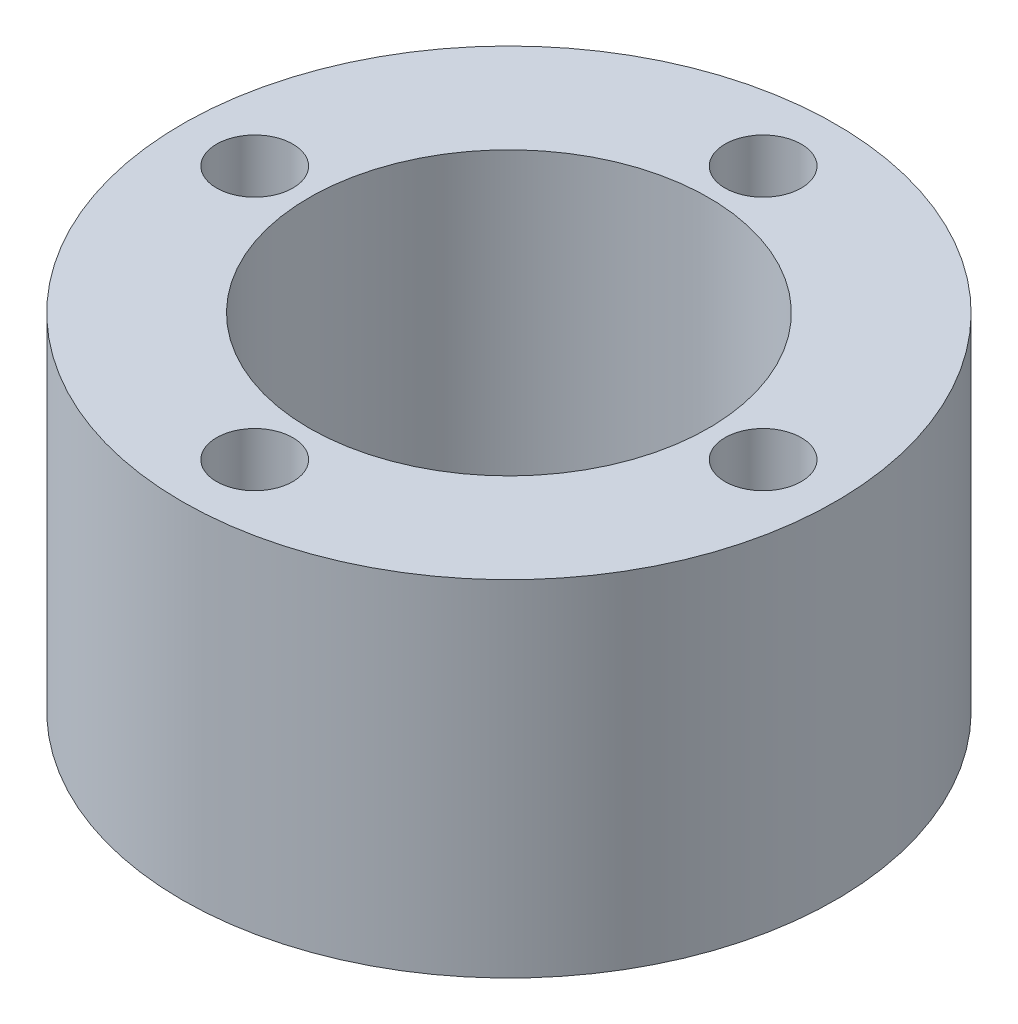
ISO-10303-21;
HEADER;
FILE_DESCRIPTION(('STEP AP214'),'2;1');
FILE_NAME('part.step','',(''),(''),'','','');
FILE_SCHEMA(('AUTOMOTIVE_DESIGN { 1 0 10303 214 1 1 1 1 }'));
ENDSEC;
DATA;
#1=APPLICATION_CONTEXT('core data for automotive mechanical design processes');
#2=APPLICATION_PROTOCOL_DEFINITION('international standard','automotive_design',2000,#1);
#3=PRODUCT_CONTEXT('',#1,'mechanical');
#4=PRODUCT('Part','Part','',(#3));
#5=PRODUCT_RELATED_PRODUCT_CATEGORY('part','',(#4));
#6=PRODUCT_DEFINITION_FORMATION('','',#4);
#7=PRODUCT_DEFINITION_CONTEXT('part definition',#1,'design');
#8=PRODUCT_DEFINITION('design','',#6,#7);
#9=PRODUCT_DEFINITION_SHAPE('','',#8);
#10=(LENGTH_UNIT() NAMED_UNIT(*) SI_UNIT(.MILLI.,.METRE.));
#11=(NAMED_UNIT(*) PLANE_ANGLE_UNIT() SI_UNIT($,.RADIAN.));
#12=(NAMED_UNIT(*) SI_UNIT($,.STERADIAN.) SOLID_ANGLE_UNIT());
#13=UNCERTAINTY_MEASURE_WITH_UNIT(LENGTH_MEASURE(1.E-05),#10,'distance_accuracy_value','');
#14=(GEOMETRIC_REPRESENTATION_CONTEXT(3) GLOBAL_UNCERTAINTY_ASSIGNED_CONTEXT((#13)) GLOBAL_UNIT_ASSIGNED_CONTEXT((#10,
#11,#12)) REPRESENTATION_CONTEXT('',''));
#15=CARTESIAN_POINT('',(0.,0.,0.));
#16=DIRECTION('',(0.,0.,1.));
#17=DIRECTION('',(1.,0.,0.));
#18=AXIS2_PLACEMENT_3D('',#15,#16,#17);
#19=CARTESIAN_POINT('',(0.,9.5,0.));
#20=DIRECTION('',(0.,1.,0.));
#21=DIRECTION('',(0.,0.,1.));
#22=AXIS2_PLACEMENT_3D('',#19,#20,#21);
#23=PLANE('',#22);
#24=CARTESIAN_POINT('',(-7.,9.5,0.));
#25=DIRECTION('',(0.,1.,0.));
#26=DIRECTION('',(0.,0.,1.));
#27=AXIS2_PLACEMENT_3D('',#24,#25,#26);
#28=CIRCLE('',#27,1.05);
#29=CARTESIAN_POINT('',(-7.,9.5,1.05));
#30=VERTEX_POINT('',#29);
#31=EDGE_CURVE('E67',#30,#30,#28,.T.);
#32=ORIENTED_EDGE('',*,*,#31,.F.);
#33=EDGE_LOOP('',(#32));
#34=FACE_BOUND('',#33,.T.);
#35=CARTESIAN_POINT('',(7.,9.5,0.));
#36=DIRECTION('',(0.,1.,0.));
#37=DIRECTION('',(0.,0.,1.));
#38=AXIS2_PLACEMENT_3D('',#35,#36,#37);
#39=CIRCLE('',#38,1.05);
#40=CARTESIAN_POINT('',(7.,9.5,1.05));
#41=VERTEX_POINT('',#40);
#42=EDGE_CURVE('E55',#41,#41,#39,.T.);
#43=ORIENTED_EDGE('',*,*,#42,.F.);
#44=EDGE_LOOP('',(#43));
#45=FACE_BOUND('',#44,.T.);
#46=CARTESIAN_POINT('',(0.,9.5,0.));
#47=DIRECTION('',(0.,1.,0.));
#48=DIRECTION('',(0.,0.,1.));
#49=AXIS2_PLACEMENT_3D('',#46,#47,#48);
#50=CIRCLE('',#49,9.);
#51=CARTESIAN_POINT('',(0.,9.5,9.));
#52=VERTEX_POINT('',#51);
#53=EDGE_CURVE('E10',#52,#52,#50,.T.);
#54=ORIENTED_EDGE('',*,*,#53,.T.);
#55=EDGE_LOOP('',(#54));
#56=FACE_BOUND('',#55,.T.);
#57=CARTESIAN_POINT('',(0.,9.5,-7.));
#58=DIRECTION('',(0.,1.,0.));
#59=DIRECTION('',(0.,0.,1.));
#60=AXIS2_PLACEMENT_3D('',#57,#58,#59);
#61=CIRCLE('',#60,1.05);
#62=CARTESIAN_POINT('',(0.,9.5,-5.95));
#63=VERTEX_POINT('',#62);
#64=EDGE_CURVE('E50',#63,#63,#61,.T.);
#65=ORIENTED_EDGE('',*,*,#64,.F.);
#66=EDGE_LOOP('',(#65));
#67=FACE_BOUND('',#66,.T.);
#68=CARTESIAN_POINT('',(0.,9.5,7.));
#69=DIRECTION('',(0.,1.,0.));
#70=DIRECTION('',(0.,0.,1.));
#71=AXIS2_PLACEMENT_3D('',#68,#69,#70);
#72=CIRCLE('',#71,1.05);
#73=CARTESIAN_POINT('',(0.,9.5,8.05));
#74=VERTEX_POINT('',#73);
#75=EDGE_CURVE('E61',#74,#74,#72,.T.);
#76=ORIENTED_EDGE('',*,*,#75,.F.);
#77=EDGE_LOOP('',(#76));
#78=FACE_BOUND('',#77,.T.);
#79=CARTESIAN_POINT('',(0.,9.5,0.));
#80=DIRECTION('',(0.,1.,0.));
#81=DIRECTION('',(0.,0.,1.));
#82=AXIS2_PLACEMENT_3D('',#79,#80,#81);
#83=CIRCLE('',#82,5.5);
#84=CARTESIAN_POINT('',(0.,9.5,5.5));
#85=VERTEX_POINT('',#84);
#86=EDGE_CURVE('E73',#85,#85,#83,.T.);
#87=ORIENTED_EDGE('',*,*,#86,.F.);
#88=EDGE_LOOP('',(#87));
#89=FACE_BOUND('',#88,.T.);
#90=ADVANCED_FACE('F39',(#34,#45,#56,#67,#78,#89),#23,.T.);
#91=CARTESIAN_POINT('',(0.,0.,0.));
#92=DIRECTION('',(0.,1.,0.));
#93=DIRECTION('',(0.,0.,1.));
#94=AXIS2_PLACEMENT_3D('',#91,#92,#93);
#95=PLANE('',#94);
#96=CARTESIAN_POINT('',(0.,0.,0.));
#97=DIRECTION('',(0.,1.,0.));
#98=DIRECTION('',(0.,0.,1.));
#99=AXIS2_PLACEMENT_3D('',#96,#97,#98);
#100=CIRCLE('',#99,9.);
#101=CARTESIAN_POINT('',(0.,0.,9.));
#102=VERTEX_POINT('',#101);
#103=EDGE_CURVE('E43',#102,#102,#100,.T.);
#104=ORIENTED_EDGE('',*,*,#103,.F.);
#105=EDGE_LOOP('',(#104));
#106=FACE_BOUND('',#105,.T.);
#107=CARTESIAN_POINT('',(0.,0.,-7.));
#108=DIRECTION('',(0.,1.,0.));
#109=DIRECTION('',(0.,0.,1.));
#110=AXIS2_PLACEMENT_3D('',#107,#108,#109);
#111=CIRCLE('',#110,1.05);
#112=CARTESIAN_POINT('',(0.,0.,-5.95));
#113=VERTEX_POINT('',#112);
#114=EDGE_CURVE('E52',#113,#113,#111,.T.);
#115=ORIENTED_EDGE('',*,*,#114,.T.);
#116=EDGE_LOOP('',(#115));
#117=FACE_BOUND('',#116,.T.);
#118=CARTESIAN_POINT('',(7.,0.,0.));
#119=DIRECTION('',(0.,1.,0.));
#120=DIRECTION('',(0.,0.,1.));
#121=AXIS2_PLACEMENT_3D('',#118,#119,#120);
#122=CIRCLE('',#121,1.05);
#123=CARTESIAN_POINT('',(7.,0.,1.05));
#124=VERTEX_POINT('',#123);
#125=EDGE_CURVE('E58',#124,#124,#122,.T.);
#126=ORIENTED_EDGE('',*,*,#125,.T.);
#127=EDGE_LOOP('',(#126));
#128=FACE_BOUND('',#127,.T.);
#129=CARTESIAN_POINT('',(0.,0.,7.));
#130=DIRECTION('',(0.,1.,0.));
#131=DIRECTION('',(0.,0.,1.));
#132=AXIS2_PLACEMENT_3D('',#129,#130,#131);
#133=CIRCLE('',#132,1.05);
#134=CARTESIAN_POINT('',(0.,0.,8.05));
#135=VERTEX_POINT('',#134);
#136=EDGE_CURVE('E64',#135,#135,#133,.T.);
#137=ORIENTED_EDGE('',*,*,#136,.T.);
#138=EDGE_LOOP('',(#137));
#139=FACE_BOUND('',#138,.T.);
#140=CARTESIAN_POINT('',(-7.,0.,0.));
#141=DIRECTION('',(0.,1.,0.));
#142=DIRECTION('',(0.,0.,1.));
#143=AXIS2_PLACEMENT_3D('',#140,#141,#142);
#144=CIRCLE('',#143,1.05);
#145=CARTESIAN_POINT('',(-7.,0.,1.05));
#146=VERTEX_POINT('',#145);
#147=EDGE_CURVE('E70',#146,#146,#144,.T.);
#148=ORIENTED_EDGE('',*,*,#147,.T.);
#149=EDGE_LOOP('',(#148));
#150=FACE_BOUND('',#149,.T.);
#151=CARTESIAN_POINT('',(0.,0.,0.));
#152=DIRECTION('',(0.,1.,0.));
#153=DIRECTION('',(0.,0.,1.));
#154=AXIS2_PLACEMENT_3D('',#151,#152,#153);
#155=CIRCLE('',#154,5.5);
#156=CARTESIAN_POINT('',(0.,0.,5.5));
#157=VERTEX_POINT('',#156);
#158=EDGE_CURVE('E76',#157,#157,#155,.T.);
#159=ORIENTED_EDGE('',*,*,#158,.T.);
#160=EDGE_LOOP('',(#159));
#161=FACE_BOUND('',#160,.T.);
#162=ADVANCED_FACE('F86',(#106,#117,#128,#139,#150,#161),#95,.F.);
#163=CARTESIAN_POINT('',(0.,9.5,0.));
#164=DIRECTION('',(0.,-1.,0.));
#165=DIRECTION('',(0.,0.,-1.));
#166=AXIS2_PLACEMENT_3D('',#163,#164,#165);
#167=CYLINDRICAL_SURFACE('',#166,9.);
#168=ORIENTED_EDGE('',*,*,#53,.F.);
#169=EDGE_LOOP('',(#168));
#170=FACE_BOUND('',#169,.T.);
#171=ORIENTED_EDGE('',*,*,#103,.T.);
#172=EDGE_LOOP('',(#171));
#173=FACE_BOUND('',#172,.T.);
#174=ADVANCED_FACE('F41',(#170,#173),#167,.T.);
#175=CARTESIAN_POINT('',(0.,9.5,-7.));
#176=DIRECTION('',(0.,-1.,0.));
#177=DIRECTION('',(0.,0.,-1.));
#178=AXIS2_PLACEMENT_3D('',#175,#176,#177);
#179=CYLINDRICAL_SURFACE('',#178,1.05);
#180=ORIENTED_EDGE('',*,*,#64,.T.);
#181=EDGE_LOOP('',(#180));
#182=FACE_BOUND('',#181,.T.);
#183=ORIENTED_EDGE('',*,*,#114,.F.);
#184=EDGE_LOOP('',(#183));
#185=FACE_BOUND('',#184,.T.);
#186=ADVANCED_FACE('F96',(#182,#185),#179,.F.);
#187=CARTESIAN_POINT('',(7.,9.5,0.));
#188=DIRECTION('',(0.,-1.,0.));
#189=DIRECTION('',(0.,0.,-1.));
#190=AXIS2_PLACEMENT_3D('',#187,#188,#189);
#191=CYLINDRICAL_SURFACE('',#190,1.05);
#192=ORIENTED_EDGE('',*,*,#42,.T.);
#193=EDGE_LOOP('',(#192));
#194=FACE_BOUND('',#193,.T.);
#195=ORIENTED_EDGE('',*,*,#125,.F.);
#196=EDGE_LOOP('',(#195));
#197=FACE_BOUND('',#196,.T.);
#198=ADVANCED_FACE('F99',(#194,#197),#191,.F.);
#199=CARTESIAN_POINT('',(0.,9.5,7.));
#200=DIRECTION('',(0.,-1.,0.));
#201=DIRECTION('',(0.,0.,-1.));
#202=AXIS2_PLACEMENT_3D('',#199,#200,#201);
#203=CYLINDRICAL_SURFACE('',#202,1.05);
#204=ORIENTED_EDGE('',*,*,#75,.T.);
#205=EDGE_LOOP('',(#204));
#206=FACE_BOUND('',#205,.T.);
#207=ORIENTED_EDGE('',*,*,#136,.F.);
#208=EDGE_LOOP('',(#207));
#209=FACE_BOUND('',#208,.T.);
#210=ADVANCED_FACE('F103',(#206,#209),#203,.F.);
#211=CARTESIAN_POINT('',(-7.,9.5,0.));
#212=DIRECTION('',(0.,-1.,0.));
#213=DIRECTION('',(0.,0.,-1.));
#214=AXIS2_PLACEMENT_3D('',#211,#212,#213);
#215=CYLINDRICAL_SURFACE('',#214,1.05);
#216=ORIENTED_EDGE('',*,*,#31,.T.);
#217=EDGE_LOOP('',(#216));
#218=FACE_BOUND('',#217,.T.);
#219=ORIENTED_EDGE('',*,*,#147,.F.);
#220=EDGE_LOOP('',(#219));
#221=FACE_BOUND('',#220,.T.);
#222=ADVANCED_FACE('F107',(#218,#221),#215,.F.);
#223=CARTESIAN_POINT('',(0.,9.5,0.));
#224=DIRECTION('',(0.,-1.,0.));
#225=DIRECTION('',(0.,0.,-1.));
#226=AXIS2_PLACEMENT_3D('',#223,#224,#225);
#227=CYLINDRICAL_SURFACE('',#226,5.5);
#228=ORIENTED_EDGE('',*,*,#86,.T.);
#229=EDGE_LOOP('',(#228));
#230=FACE_BOUND('',#229,.T.);
#231=ORIENTED_EDGE('',*,*,#158,.F.);
#232=EDGE_LOOP('',(#231));
#233=FACE_BOUND('',#232,.T.);
#234=ADVANCED_FACE('F82',(#230,#233),#227,.F.);
#235=CLOSED_SHELL('',(#90,#162,#174,#186,#198,#210,#222,#234));
#236=MANIFOLD_SOLID_BREP('B2',#235);
#237=ADVANCED_BREP_SHAPE_REPRESENTATION('',(#18,#236),#14);
#238=SHAPE_DEFINITION_REPRESENTATION(#9,#237);
ENDSEC;
END-ISO-10303-21;
